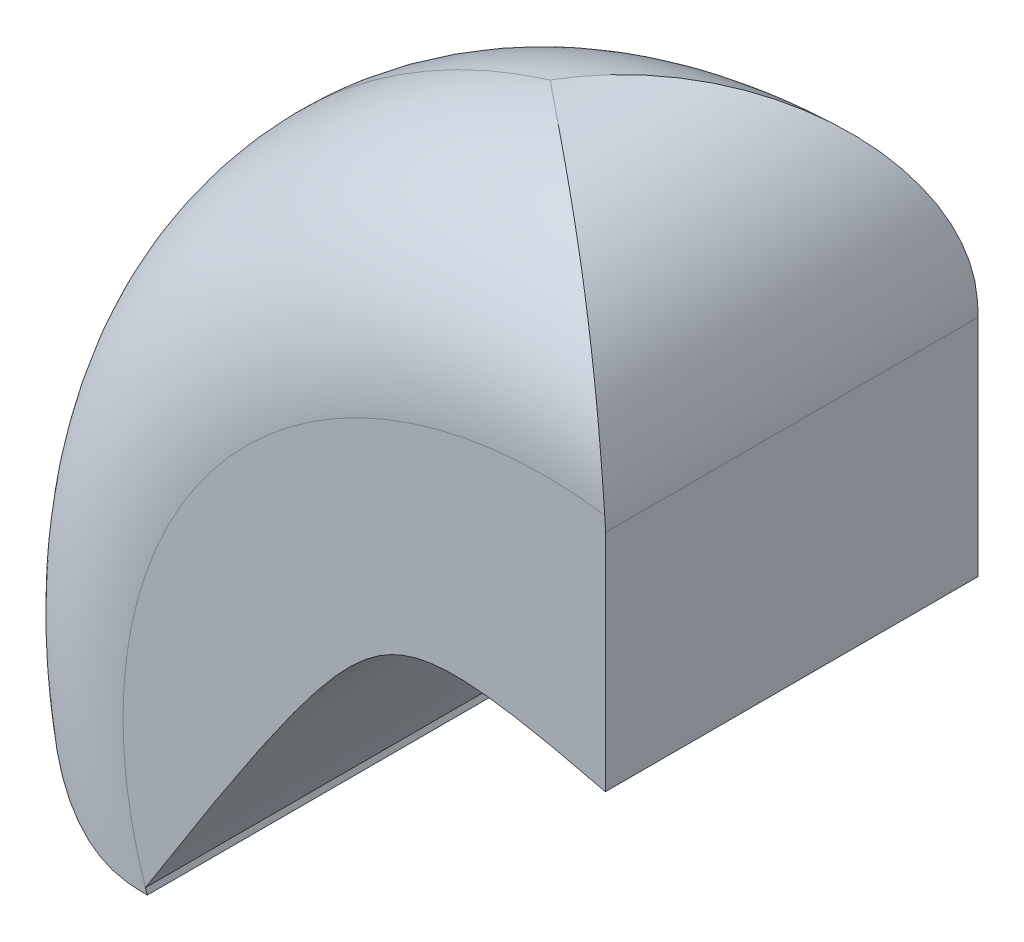
ISO-10303-21;
HEADER;
FILE_DESCRIPTION(('STEP AP214'),'2;1');
FILE_NAME('part.step','',(''),(''),'','','');
FILE_SCHEMA(('AUTOMOTIVE_DESIGN { 1 0 10303 214 1 1 1 1 }'));
ENDSEC;
DATA;
#1=APPLICATION_CONTEXT('core data for automotive mechanical design processes');
#2=APPLICATION_PROTOCOL_DEFINITION('international standard','automotive_design',2000,#1);
#3=PRODUCT_CONTEXT('',#1,'mechanical');
#4=PRODUCT('Part','Part','',(#3));
#5=PRODUCT_RELATED_PRODUCT_CATEGORY('part','',(#4));
#6=PRODUCT_DEFINITION_FORMATION('','',#4);
#7=PRODUCT_DEFINITION_CONTEXT('part definition',#1,'design');
#8=PRODUCT_DEFINITION('design','',#6,#7);
#9=PRODUCT_DEFINITION_SHAPE('','',#8);
#10=(LENGTH_UNIT() NAMED_UNIT(*) SI_UNIT(.MILLI.,.METRE.));
#11=(NAMED_UNIT(*) PLANE_ANGLE_UNIT() SI_UNIT($,.RADIAN.));
#12=(NAMED_UNIT(*) SI_UNIT($,.STERADIAN.) SOLID_ANGLE_UNIT());
#13=UNCERTAINTY_MEASURE_WITH_UNIT(LENGTH_MEASURE(1.E-05),#10,'distance_accuracy_value','');
#14=(GEOMETRIC_REPRESENTATION_CONTEXT(3) GLOBAL_UNCERTAINTY_ASSIGNED_CONTEXT((#13)) GLOBAL_UNIT_ASSIGNED_CONTEXT((#10,
#11,#12)) REPRESENTATION_CONTEXT('',''));
#15=CARTESIAN_POINT('',(0.,0.,0.));
#16=DIRECTION('',(0.,0.,1.));
#17=DIRECTION('',(1.,0.,0.));
#18=AXIS2_PLACEMENT_3D('',#15,#16,#17);
#19=CARTESIAN_POINT('',(0.,0.,5.08));
#20=DIRECTION('',(-1.,0.,0.));
#21=DIRECTION('',(0.,0.,1.));
#22=AXIS2_PLACEMENT_3D('',#19,#20,#21);
#23=PLANE('',#22);
#24=DIRECTION('',(0.,1.,0.));
#25=VECTOR('',#24,1.);
#26=CARTESIAN_POINT('',(0.,0.,5.08));
#27=LINE('',#26,#25);
#28=CARTESIAN_POINT('',(0.,4.34245675491222,5.08));
#29=VERTEX_POINT('',#28);
#30=CARTESIAN_POINT('',(0.,7.40395362170021,5.08));
#31=VERTEX_POINT('',#30);
#32=EDGE_CURVE('E118',#29,#31,#27,.T.);
#33=ORIENTED_EDGE('',*,*,#32,.F.);
#34=DIRECTION('',(0.,0.,-1.));
#35=VECTOR('',#34,1.);
#36=CARTESIAN_POINT('',(0.,4.34245675491222,5.08));
#37=LINE('',#36,#35);
#38=CARTESIAN_POINT('',(0.,4.34245675491222,0.));
#39=VERTEX_POINT('',#38);
#40=EDGE_CURVE('E273',#29,#39,#37,.T.);
#41=ORIENTED_EDGE('',*,*,#40,.T.);
#42=DIRECTION('',(0.,1.,0.));
#43=VECTOR('',#42,1.);
#44=CARTESIAN_POINT('',(0.,0.,0.));
#45=LINE('',#44,#43);
#46=CARTESIAN_POINT('',(0.,7.40395362170021,0.));
#47=VERTEX_POINT('',#46);
#48=EDGE_CURVE('E97',#39,#47,#45,.T.);
#49=ORIENTED_EDGE('',*,*,#48,.T.);
#50=DIRECTION('',(0.,0.,-1.));
#51=VECTOR('',#50,1.);
#52=CARTESIAN_POINT('',(0.,7.40395362170021,5.08));
#53=LINE('',#52,#51);
#54=EDGE_CURVE('E134',#47,#31,#53,.F.);
#55=ORIENTED_EDGE('',*,*,#54,.T.);
#56=EDGE_LOOP('',(#33,#41,#49,#55));
#57=FACE_BOUND('',#56,.T.);
#58=ADVANCED_FACE('F45',(#57),#23,.F.);
#59=CARTESIAN_POINT('',(0.,0.,5.08));
#60=DIRECTION('',(0.,1.,0.));
#61=DIRECTION('',(-1.,0.,0.));
#62=AXIS2_PLACEMENT_3D('',#59,#60,#61);
#63=PLANE('',#62);
#64=CARTESIAN_POINT('',(-6.54316799946702,0.,0.0157109597668454));
#65=CARTESIAN_POINT('',(-6.49355678094474,0.,0.0104676259886185));
#66=CARTESIAN_POINT('',(-6.44387648483013,0.,0.00653671245842265));
#67=CARTESIAN_POINT('',(-6.34437793053601,0.,0.00129973605869758));
#68=CARTESIAN_POINT('',(-6.29455967289278,0.,-6.3370000552407E-06));
#69=CARTESIAN_POINT('',(-6.24467233819353,0.,0.));
#70=B_SPLINE_CURVE_WITH_KNOTS('',3,(#64,#65,#66,#67,#68,#69),.UNSPECIFIED.,.F.,.F.,(4,2,4),(0.,
0.149506705966484,0.299012831570005),.UNSPECIFIED.);
#71=CARTESIAN_POINT('',(-6.54316799946702,0.,0.0157109597668454));
#72=VERTEX_POINT('',#71);
#73=CARTESIAN_POINT('',(-6.24467233819353,0.,0.));
#74=VERTEX_POINT('',#73);
#75=EDGE_CURVE('E123',#72,#74,#70,.T.);
#76=ORIENTED_EDGE('',*,*,#75,.T.);
#77=DIRECTION('',(0.,0.,-1.));
#78=VECTOR('',#77,1.);
#79=CARTESIAN_POINT('',(-6.24467233819353,0.,5.08));
#80=LINE('',#79,#78);
#81=CARTESIAN_POINT('',(-6.24467233819353,0.,5.08));
#82=VERTEX_POINT('',#81);
#83=EDGE_CURVE('E148',#82,#74,#80,.T.);
#84=ORIENTED_EDGE('',*,*,#83,.F.);
#85=CARTESIAN_POINT('',(-6.24467233819353,0.,5.08));
#86=CARTESIAN_POINT('',(-6.29455967289278,0.,5.08000633700006));
#87=CARTESIAN_POINT('',(-6.34437793053601,0.,5.0787002639413));
#88=CARTESIAN_POINT('',(-6.44387648483013,0.,5.07346328754158));
#89=CARTESIAN_POINT('',(-6.49355678094474,0.,5.06953237401138));
#90=CARTESIAN_POINT('',(-6.54316799946702,0.,5.06428904023316));
#91=B_SPLINE_CURVE_WITH_KNOTS('',3,(#85,#86,#87,#88,#89,#90),.UNSPECIFIED.,.F.,.F.,(4,2,4),(0.,
0.14950612560352,0.299012831570005),.UNSPECIFIED.);
#92=CARTESIAN_POINT('',(-6.54316799946702,0.,5.06428904023316));
#93=VERTEX_POINT('',#92);
#94=EDGE_CURVE('E11',#82,#93,#91,.T.);
#95=ORIENTED_EDGE('',*,*,#94,.T.);
#96=DIRECTION('',(0.,0.,-1.));
#97=VECTOR('',#96,1.);
#98=CARTESIAN_POINT('',(-6.54316799946702,0.,5.08));
#99=LINE('',#98,#97);
#100=EDGE_CURVE('E57',#93,#72,#99,.T.);
#101=ORIENTED_EDGE('',*,*,#100,.T.);
#102=EDGE_LOOP('',(#76,#84,#95,#101));
#103=FACE_BOUND('',#102,.T.);
#104=ADVANCED_FACE('F193',(#103),#63,.F.);
#105=CARTESIAN_POINT('',(-0.837038302501056,1.92303351468843,5.08));
#106=DIRECTION('',(0.,0.,-1.));
#107=DIRECTION('',(-1.,0.,0.));
#108=AXIS2_PLACEMENT_3D('',#105,#106,#107);
#109=PLANE('',#108);
#110=CARTESIAN_POINT('',(-0.837038302501056,1.92303351468843,5.08));
#111=DIRECTION('',(0.,0.,-1.));
#112=DIRECTION('',(-1.,0.,0.));
#113=AXIS2_PLACEMENT_3D('',#110,#111,#112);
#114=CIRCLE('',#113,5.73938705460736);
#115=CARTESIAN_POINT('',(-0.00774773136569848,7.60219198326637,5.08));
#116=VERTEX_POINT('',#115);
#117=CARTESIAN_POINT('',(-6.27077992340722,0.0750573893484264,5.08));
#118=VERTEX_POINT('',#117);
#119=EDGE_CURVE('E116',#116,#118,#114,.F.);
#120=ORIENTED_EDGE('',*,*,#119,.T.);
#121=CARTESIAN_POINT('',(-6.27077992340722,0.0750573893484264,5.08));
#122=CARTESIAN_POINT('',(-3.10583538181274,5.11338393814638,5.08));
#123=CARTESIAN_POINT('',(0.,4.34245675491222,5.08));
#124=(BOUNDED_CURVE() B_SPLINE_CURVE(2,(#121,#122,#123),.UNSPECIFIED.,.F.,
.F.) B_SPLINE_CURVE_WITH_KNOTS((3,3),(0.,1.),
.UNSPECIFIED.) CURVE() GEOMETRIC_REPRESENTATION_ITEM() RATIONAL_B_SPLINE_CURVE((1.,3.,1.)) REPRESENTATION_ITEM(''));
#125=EDGE_CURVE('E232',#118,#29,#124,.T.);
#126=ORIENTED_EDGE('',*,*,#125,.T.);
#127=ORIENTED_EDGE('',*,*,#32,.T.);
#128=CARTESIAN_POINT('',(-2.54,7.40395362170021,5.08));
#129=DIRECTION('',(0.,0.,-1.));
#130=DIRECTION('',(-1.,0.,0.));
#131=AXIS2_PLACEMENT_3D('',#128,#129,#130);
#132=CIRCLE('',#131,2.54);
#133=EDGE_CURVE('E111',#31,#116,#132,.F.);
#134=ORIENTED_EDGE('',*,*,#133,.T.);
#135=EDGE_LOOP('',(#120,#126,#127,#134));
#136=FACE_BOUND('',#135,.T.);
#137=ADVANCED_FACE('F113',(#136),#109,.F.);
#138=CARTESIAN_POINT('',(-0.837038302501056,1.92303351468843,0.));
#139=DIRECTION('',(0.,0.,-1.));
#140=DIRECTION('',(-1.,0.,0.));
#141=AXIS2_PLACEMENT_3D('',#138,#139,#140);
#142=PLANE('',#141);
#143=CARTESIAN_POINT('',(-6.27077992340722,0.0750573893484264,0.));
#144=CARTESIAN_POINT('',(-3.10583538181274,5.11338393814638,0.));
#145=CARTESIAN_POINT('',(0.,4.34245675491222,0.));
#146=(BOUNDED_CURVE() B_SPLINE_CURVE(2,(#143,#144,#145),.UNSPECIFIED.,.F.,
.F.) B_SPLINE_CURVE_WITH_KNOTS((3,3),(0.,1.),
.UNSPECIFIED.) CURVE() GEOMETRIC_REPRESENTATION_ITEM() RATIONAL_B_SPLINE_CURVE((1.,3.,1.)) REPRESENTATION_ITEM(''));
#147=CARTESIAN_POINT('',(-6.27077992340721,0.0750573893483978,0.));
#148=VERTEX_POINT('',#147);
#149=EDGE_CURVE('E217',#148,#39,#146,.T.);
#150=ORIENTED_EDGE('',*,*,#149,.F.);
#151=CARTESIAN_POINT('',(-0.837038302501056,1.92303351468843,0.));
#152=DIRECTION('',(0.,0.,-1.));
#153=DIRECTION('',(-1.,0.,0.));
#154=AXIS2_PLACEMENT_3D('',#151,#152,#153);
#155=CIRCLE('',#154,5.73938705460736);
#156=CARTESIAN_POINT('',(-0.00774773136569848,7.60219198326637,0.));
#157=VERTEX_POINT('',#156);
#158=EDGE_CURVE('E190',#148,#157,#155,.T.);
#159=ORIENTED_EDGE('',*,*,#158,.T.);
#160=CARTESIAN_POINT('',(-2.54,7.40395362170021,0.));
#161=DIRECTION('',(0.,0.,-1.));
#162=DIRECTION('',(-1.,0.,0.));
#163=AXIS2_PLACEMENT_3D('',#160,#161,#162);
#164=CIRCLE('',#163,2.54);
#165=EDGE_CURVE('E285',#157,#47,#164,.T.);
#166=ORIENTED_EDGE('',*,*,#165,.T.);
#167=ORIENTED_EDGE('',*,*,#48,.F.);
#168=EDGE_LOOP('',(#150,#159,#166,#167));
#169=FACE_BOUND('',#168,.T.);
#170=ADVANCED_FACE('F197',(#169),#142,.T.);
#171=CARTESIAN_POINT('',(-6.54316799946702,2.54,5.08));
#172=DIRECTION('',(0.,0.,-1.));
#173=DIRECTION('',(-1.,0.,0.));
#174=AXIS2_PLACEMENT_3D('',#171,#172,#173);
#175=CYLINDRICAL_SURFACE('',#174,2.54);
#176=CARTESIAN_POINT('',(-6.54316799946702,0.,0.0157109597668451));
#177=CARTESIAN_POINT('',(-6.60714881719256,-1.28476726861553E-05,0.0224810006136962));
#178=CARTESIAN_POINT('',(-6.67087189456624,0.00241678674781688,0.0313703791266913));
#179=CARTESIAN_POINT('',(-6.79722853600247,0.0119484091850614,0.0530128650855246));
#180=CARTESIAN_POINT('',(-6.85986333890803,0.0190446708566967,0.0657612268995341));
#181=CARTESIAN_POINT('',(-6.98311907072323,0.0376211379207654,0.0946456974701581));
#182=CARTESIAN_POINT('',(-7.04375233441022,0.0490647689231595,0.110753050488879));
#183=CARTESIAN_POINT('',(-7.16317123313368,0.0760706008914642,0.146062834106937));
#184=CARTESIAN_POINT('',(-7.22195631280763,0.0916340268319717,0.165266184601192));
#185=CARTESIAN_POINT('',(-7.3944743533249,0.143911035221132,0.226806496038314));
#186=CARTESIAN_POINT('',(-7.50508249855254,0.186324022130721,0.273246818079727));
#187=CARTESIAN_POINT('',(-7.71630395075185,0.284125037142435,0.374788713681231));
#188=CARTESIAN_POINT('',(-7.81689006522029,0.339547066220788,0.429912857305286));
#189=CARTESIAN_POINT('',(-8.04489271387911,0.48542094705091,0.570220342762428));
#190=CARTESIAN_POINT('',(-8.167045549783,0.581034066375106,0.658633033240366));
#191=CARTESIAN_POINT('',(-8.38855616536181,0.788090637724865,0.844707168168847));
#192=CARTESIAN_POINT('',(-8.48789800077185,0.899545074833337,0.942375014764863));
#193=CARTESIAN_POINT('',(-8.66463604113625,1.13538738908608,1.14546028528494));
#194=CARTESIAN_POINT('',(-8.74175070147136,1.25991605512064,1.25095750158529));
#195=CARTESIAN_POINT('',(-8.87253627349082,1.51702945528297,1.46659720303595));
#196=CARTESIAN_POINT('',(-8.92619162888262,1.64961946887078,1.57674271764425));
#197=CARTESIAN_POINT('',(-9.02010785224863,1.95110727130301,1.82618189686954));
#198=CARTESIAN_POINT('',(-9.05430150127103,2.12124435133146,1.9662680335754));
#199=CARTESIAN_POINT('',(-9.08777442808837,2.46287865372027,2.24839475454085));
#200=CARTESIAN_POINT('',(-9.0871229268869,2.63437250285147,2.39043090359038));
#201=CARTESIAN_POINT('',(-9.06911085933865,2.80687512769028,2.5348359109606));
#202=CARTESIAN_POINT('',(-9.06878313138247,2.80995901712403,2.53741799483571));
#203=CARTESIAN_POINT('',(-9.06844975732627,2.81304220081017,2.54));
#204=B_SPLINE_CURVE_WITH_KNOTS('',3,(#176,#177,#178,#179,#180,#181,#182,#183,#184,#185,#186,
#187,#188,#189,#190,#191,#192,#193,#194,#195,#196,#197,#198,#199,#200,#201,#202,#203),
.UNSPECIFIED.,.F.,.F.,(4,2,2,2,2,2,2,2,2,2,2,2,2,4),(0.,0.192883410046523,0.385530576424733,
0.576591662394493,0.767709622162052,1.14774768198885,1.52879030806886,2.06155202858977,
2.59468500904678,3.1343008102322,3.67427389977829,4.34052994901157,5.00546250858169,
5.01756886958733),.UNSPECIFIED.);
#205=CARTESIAN_POINT('',(-9.06844975732627,2.81304220081017,2.54));
#206=VERTEX_POINT('',#205);
#207=EDGE_CURVE('E141',#72,#206,#204,.T.);
#208=ORIENTED_EDGE('',*,*,#207,.F.);
#209=ORIENTED_EDGE('',*,*,#100,.F.);
#210=CARTESIAN_POINT('',(-6.54316799946702,0.,5.06428904023316));
#211=CARTESIAN_POINT('',(-6.60714881719256,-1.28476726862409E-05,5.0575189993863));
#212=CARTESIAN_POINT('',(-6.67087189456624,0.00241678674781677,5.04862962087331));
#213=CARTESIAN_POINT('',(-6.79722853600247,0.0119484091850613,5.02698713491448));
#214=CARTESIAN_POINT('',(-6.85986333890803,0.0190446708566966,5.01423877310047));
#215=CARTESIAN_POINT('',(-6.98311907072323,0.0376211379207652,4.98535430252984));
#216=CARTESIAN_POINT('',(-7.04375233441022,0.0490647689231592,4.96924694951112));
#217=CARTESIAN_POINT('',(-7.16317123313368,0.076070600891464,4.93393716589306));
#218=CARTESIAN_POINT('',(-7.22195631280763,0.0916340268319716,4.91473381539881));
#219=CARTESIAN_POINT('',(-7.3944743533249,0.143911035221132,4.85319350396169));
#220=CARTESIAN_POINT('',(-7.50508249855254,0.186324022130721,4.80675318192027));
#221=CARTESIAN_POINT('',(-7.71630395075185,0.284125037142436,4.70521128631877));
#222=CARTESIAN_POINT('',(-7.81689006522029,0.339547066220789,4.65008714269471));
#223=CARTESIAN_POINT('',(-8.04489271387911,0.48542094705091,4.50977965723757));
#224=CARTESIAN_POINT('',(-8.167045549783,0.581034066375106,4.42136696675963));
#225=CARTESIAN_POINT('',(-8.38855616536181,0.788090637724865,4.23529283183115));
#226=CARTESIAN_POINT('',(-8.48789800077185,0.899545074833337,4.13762498523514));
#227=CARTESIAN_POINT('',(-8.66463604113625,1.13538738908608,3.93453971471506));
#228=CARTESIAN_POINT('',(-8.74175070147136,1.25991605512064,3.82904249841471));
#229=CARTESIAN_POINT('',(-8.87253627349082,1.51702945528297,3.61340279696405));
#230=CARTESIAN_POINT('',(-8.92619162888262,1.64961946887078,3.50325728235575));
#231=CARTESIAN_POINT('',(-9.02010785224863,1.95110727130301,3.25381810313046));
#232=CARTESIAN_POINT('',(-9.05430150127103,2.12124435133145,3.11373196642459));
#233=CARTESIAN_POINT('',(-9.08777442808837,2.46287865372027,2.83160524545916));
#234=CARTESIAN_POINT('',(-9.0871229268869,2.63437250285148,2.68956909640963));
#235=CARTESIAN_POINT('',(-9.06911085933865,2.80687512769028,2.5451640890394));
#236=CARTESIAN_POINT('',(-9.06878313138247,2.80995901712403,2.54258200516429));
#237=CARTESIAN_POINT('',(-9.06844975732627,2.81304220081017,2.54));
#238=B_SPLINE_CURVE_WITH_KNOTS('',3,(#210,#211,#212,#213,#214,#215,#216,#217,#218,#219,#220,
#221,#222,#223,#224,#225,#226,#227,#228,#229,#230,#231,#232,#233,#234,#235,#236,#237),
.UNSPECIFIED.,.F.,.F.,(4,2,2,2,2,2,2,2,2,2,2,2,2,4),(0.,0.192883410046523,0.385530576424732,
0.576591662394493,0.767709622162052,1.14774768198885,1.52879030806886,2.06155202858977,
2.59468500904678,3.1343008102322,3.67427389977829,4.34052994901157,5.00546250858169,
5.01756886958733),.UNSPECIFIED.);
#239=EDGE_CURVE('E88',#206,#93,#238,.F.);
#240=ORIENTED_EDGE('',*,*,#239,.F.);
#241=EDGE_LOOP('',(#208,#209,#240));
#242=FACE_BOUND('',#241,.T.);
#243=ADVANCED_FACE('F47',(#242),#175,.T.);
#244=CARTESIAN_POINT('',(-0.837038302501056,1.92303351468843,2.54));
#245=DIRECTION('',(0.,0.,-1.));
#246=DIRECTION('',(-1.,0.,0.));
#247=AXIS2_PLACEMENT_3D('',#244,#245,#246);
#248=TOROIDAL_SURFACE('',#247,5.73938705460736,2.54);
#249=CARTESIAN_POINT('',(-0.837038302501056,1.92303351468843,2.54));
#250=DIRECTION('',(0.,0.,-1.));
#251=DIRECTION('',(-1.,0.,0.));
#252=AXIS2_PLACEMENT_3D('',#249,#250,#251);
#253=CIRCLE('',#252,8.27938705460736);
#254=CARTESIAN_POINT('',(-3.29365586437927,9.82956753122636,2.54));
#255=VERTEX_POINT('',#254);
#256=EDGE_CURVE('E146',#206,#255,#253,.T.);
#257=ORIENTED_EDGE('',*,*,#256,.F.);
#258=ORIENTED_EDGE('',*,*,#239,.T.);
#259=ORIENTED_EDGE('',*,*,#94,.F.);
#260=CARTESIAN_POINT('',(-6.24467233819353,0.,5.08));
#261=CARTESIAN_POINT('',(-6.24578178818526,0.00311981017111341,5.08));
#262=CARTESIAN_POINT('',(-6.24688853831713,0.00624058045175843,5.08));
#263=CARTESIAN_POINT('',(-6.2490966355585,0.0124840318790026,5.08));
#264=CARTESIAN_POINT('',(-6.25019798266801,0.0156067130256019,5.08));
#265=CARTESIAN_POINT('',(-6.25239527056204,0.0218539768316577,5.08));
#266=CARTESIAN_POINT('',(-6.25349121134656,0.0249785594911144,5.08));
#267=CARTESIAN_POINT('',(-6.25567768330856,0.0312296169625446,5.08));
#268=CARTESIAN_POINT('',(-6.25676821448603,0.0343560917745181,5.08));
#269=CARTESIAN_POINT('',(-6.25894386396681,0.0406109241854185,5.08));
#270=CARTESIAN_POINT('',(-6.26002898227012,0.0437392817843453,5.08));
#271=CARTESIAN_POINT('',(-6.26219380275232,0.0499978703977305,5.08));
#272=CARTESIAN_POINT('',(-6.2632735049312,0.0531281014121889,5.08));
#273=CARTESIAN_POINT('',(-6.26542748992924,0.0593904274800281,5.08));
#274=CARTESIAN_POINT('',(-6.26650177274839,0.0625225225334088,5.08));
#275=CARTESIAN_POINT('',(-6.26864491581229,0.0687885672954092,5.08));
#276=CARTESIAN_POINT('',(-6.26971377605703,0.0719225170040288,5.08));
#277=CARTESIAN_POINT('',(-6.27077992340722,0.0750573893484238,5.08));
#278=B_SPLINE_CURVE_WITH_KNOTS('',3,(#260,#261,#262,#263,#264,#265,#266,#267,#268,#269,#270,
#271,#272,#273,#274,#275,#276,#277),.UNSPECIFIED.,.F.,.F.,(4,2,2,2,2,2,2,2,4),(0.,
0.00993362111509972,0.0198672422301952,0.0298008633452953,0.03973448446039,0.0496681055754851,
0.0596017266905851,0.0695353478056805,0.0794689689207806),.UNSPECIFIED.);
#279=EDGE_CURVE('E132',#82,#118,#278,.T.);
#280=ORIENTED_EDGE('',*,*,#279,.T.);
#281=ORIENTED_EDGE('',*,*,#119,.F.);
#282=CARTESIAN_POINT('',(-0.00774773136569843,7.60219198326637,5.08));
#283=CARTESIAN_POINT('',(-0.0124037908059106,7.66184961928538,5.0800087513756));
#284=CARTESIAN_POINT('',(-0.0191941264921294,7.72131855625276,5.07798916843495));
#285=CARTESIAN_POINT('',(-0.0368850521955316,7.83933009237561,5.07014452638805));
#286=CARTESIAN_POINT('',(-0.0477815425398501,7.89787355499768,5.06432325872977));
#287=CARTESIAN_POINT('',(-0.0734348645494268,8.01314992193633,5.04918535600712));
#288=CARTESIAN_POINT('',(-0.0881605960884955,8.06989345911759,5.03989662948735));
#289=CARTESIAN_POINT('',(-0.121286187115521,8.1816589499645,5.01810412274041));
#290=CARTESIAN_POINT('',(-0.139686865017199,8.2366805169831,5.00559962617973));
#291=CARTESIAN_POINT('',(-0.199880803386818,8.39822817730459,4.96379909565233));
#292=CARTESIAN_POINT('',(-0.246791138368046,8.50178594712665,4.9301394213574));
#293=CARTESIAN_POINT('',(-0.352161087697061,8.69915516813249,4.85333420462024));
#294=CARTESIAN_POINT('',(-0.410647100993167,8.79294357940293,4.81016695377863));
#295=CARTESIAN_POINT('',(-0.559675993997041,9.00134041571995,4.69946133481418));
#296=CARTESIAN_POINT('',(-0.654206588847845,9.11141598293963,4.62872583114615));
#297=CARTESIAN_POINT('',(-0.856029241982378,9.31079395126365,4.47706624064237));
#298=CARTESIAN_POINT('',(-0.963337196342943,9.40007005937911,4.39612945510177));
#299=CARTESIAN_POINT('',(-1.21372013995268,9.57681663349793,4.20648426916653));
#300=CARTESIAN_POINT('',(-1.35920235916713,9.65872303076807,4.09576976916503));
#301=CARTESIAN_POINT('',(-1.65796396977771,9.7915023105089,3.86663358910395));
#302=CARTESIAN_POINT('',(-1.81124998411714,9.84234834041101,3.7482053378796));
#303=CARTESIAN_POINT('',(-2.1224395402398,9.91453607999357,3.50498229953734));
#304=CARTESIAN_POINT('',(-2.28037539329774,9.93554545382114,3.38013160976972));
#305=CARTESIAN_POINT('',(-2.59469014735819,9.94822643384095,3.12755078635295));
#306=CARTESIAN_POINT('',(-2.75107080313186,9.93993608348508,2.99982460039872));
#307=CARTESIAN_POINT('',(-3.03371591313535,9.89890677720055,2.76382029732412));
#308=CARTESIAN_POINT('',(-3.16075600304004,9.8703449249352,2.65574271579921));
#309=CARTESIAN_POINT('',(-3.28773106676035,9.83140246613624,2.545164113523));
#310=CARTESIAN_POINT('',(-3.29069433984387,9.83048770322522,2.54258202979049));
#311=CARTESIAN_POINT('',(-3.29365586437927,9.82956753122636,2.54));
#312=B_SPLINE_CURVE_WITH_KNOTS('',3,(#282,#283,#284,#285,#286,#287,#288,#289,#290,#291,#292,
#293,#294,#295,#296,#297,#298,#299,#300,#301,#302,#303,#304,#305,#306,#307,#308,#309,#310,#311),
.UNSPECIFIED.,.F.,.F.,(4,2,2,2,2,2,2,2,2,2,2,2,2,2,4),(0.,0.179412283289363,0.358645910081305,
0.536466996950795,0.714327728976481,1.06836704503605,1.42322326817,1.90485818718616,
2.38709868590467,2.98495169354219,3.58332083327128,4.18830399721821,4.79250192553294,
5.29884522706015,5.31095158806578),.UNSPECIFIED.);
#313=EDGE_CURVE('E129',#255,#116,#312,.F.);
#314=ORIENTED_EDGE('',*,*,#313,.F.);
#315=EDGE_LOOP('',(#257,#258,#259,#280,#281,#314));
#316=FACE_BOUND('',#315,.T.);
#317=ADVANCED_FACE('F128',(#316),#248,.T.);
#318=CARTESIAN_POINT('',(-0.837038302501056,1.92303351468843,2.54));
#319=DIRECTION('',(0.,0.,-1.));
#320=DIRECTION('',(-1.,0.,0.));
#321=AXIS2_PLACEMENT_3D('',#318,#319,#320);
#322=TOROIDAL_SURFACE('',#321,5.73938705460736,2.54);
#323=ORIENTED_EDGE('',*,*,#207,.T.);
#324=ORIENTED_EDGE('',*,*,#256,.T.);
#325=CARTESIAN_POINT('',(-0.00774773136569843,7.60219198326637,0.));
#326=CARTESIAN_POINT('',(-0.0124037908059108,7.66184961928538,-8.75137560149685E-06));
#327=CARTESIAN_POINT('',(-0.0191941264921296,7.72131855625276,0.00201083156505524));
#328=CARTESIAN_POINT('',(-0.0368850521955316,7.83933009237561,0.00985547361194899));
#329=CARTESIAN_POINT('',(-0.0477815425398499,7.89787355499768,0.0156767412702318));
#330=CARTESIAN_POINT('',(-0.0734348645494265,8.01314992193633,0.0308146439928752));
#331=CARTESIAN_POINT('',(-0.0881605960884953,8.06989345911759,0.040103370512647));
#332=CARTESIAN_POINT('',(-0.121286187115521,8.1816589499645,0.0618958772595885));
#333=CARTESIAN_POINT('',(-0.1396868650172,8.2366805169831,0.0744003738202751));
#334=CARTESIAN_POINT('',(-0.199880803386819,8.39822817730459,0.116200904347671));
#335=CARTESIAN_POINT('',(-0.246791138368046,8.50178594712665,0.149860578642603));
#336=CARTESIAN_POINT('',(-0.352161087697062,8.69915516813249,0.226665795379762));
#337=CARTESIAN_POINT('',(-0.410647100993168,8.79294357940293,0.269833046221375));
#338=CARTESIAN_POINT('',(-0.55967599399704,9.00134041571994,0.380538665185815));
#339=CARTESIAN_POINT('',(-0.654206588847842,9.11141598293963,0.451274168853848));
#340=CARTESIAN_POINT('',(-0.856029241982375,9.31079395126364,0.602933759357623));
#341=CARTESIAN_POINT('',(-0.963337196342944,9.4000700593791,0.683870544898229));
#342=CARTESIAN_POINT('',(-1.21372013995268,9.57681663349794,0.873515730833479));
#343=CARTESIAN_POINT('',(-1.35920235916713,9.65872303076807,0.984230230834991));
#344=CARTESIAN_POINT('',(-1.65796396977773,9.79150231050889,1.21336641089604));
#345=CARTESIAN_POINT('',(-1.81124998411719,9.84234834041099,1.33179466212033));
#346=CARTESIAN_POINT('',(-2.12243954023973,9.91453607999359,1.57501770046273));
#347=CARTESIAN_POINT('',(-2.28037539329752,9.9355454538212,1.69986839023053));
#348=CARTESIAN_POINT('',(-2.59469014735838,9.94822643384088,1.95244921364679));
#349=CARTESIAN_POINT('',(-2.75107080313262,9.93993608348484,2.08017539960032));
#350=CARTESIAN_POINT('',(-3.0337159131347,9.89890677720074,2.31617970267669));
#351=CARTESIAN_POINT('',(-3.16075600303783,9.87034492493587,2.42425728420357));
#352=CARTESIAN_POINT('',(-3.28773106676025,9.83140246613628,2.53483588647713));
#353=CARTESIAN_POINT('',(-3.29069433984382,9.83048770322523,2.53741797020958));
#354=CARTESIAN_POINT('',(-3.29365586437927,9.82956753122636,2.54));
#355=B_SPLINE_CURVE_WITH_KNOTS('',3,(#325,#326,#327,#328,#329,#330,#331,#332,#333,#334,#335,
#336,#337,#338,#339,#340,#341,#342,#343,#344,#345,#346,#347,#348,#349,#350,#351,#352,#353,#354),
.UNSPECIFIED.,.F.,.F.,(4,2,2,2,2,2,2,2,2,2,2,2,2,2,4),(0.,0.179412283289362,0.358645910081303,
0.536466996950795,0.714327728976481,1.06836704503605,1.42322326817,1.90485818718615,
2.38709868590467,2.9849516935422,3.58332083327128,4.18830399721819,4.79250192553294,
5.29884522706015,5.31095158806578),.UNSPECIFIED.);
#356=EDGE_CURVE('E139',#157,#255,#355,.T.);
#357=ORIENTED_EDGE('',*,*,#356,.F.);
#358=ORIENTED_EDGE('',*,*,#158,.F.);
#359=CARTESIAN_POINT('',(-6.24467233819353,0.,0.));
#360=DIRECTION('',(-0.32852811437326,0.944494191653051,0.));
#361=VECTOR('',#360,1.);
#362=LINE('',#359,#361);
#363=EDGE_CURVE('E65',#74,#148,#362,.T.);
#364=ORIENTED_EDGE('',*,*,#363,.F.);
#365=ORIENTED_EDGE('',*,*,#75,.F.);
#366=EDGE_LOOP('',(#323,#324,#357,#358,#364,#365));
#367=FACE_BOUND('',#366,.T.);
#368=ADVANCED_FACE('F171',(#367),#322,.T.);
#369=CARTESIAN_POINT('',(-2.54,7.40395362170021,5.08));
#370=DIRECTION('',(0.,0.,-1.));
#371=DIRECTION('',(-1.,0.,0.));
#372=AXIS2_PLACEMENT_3D('',#369,#370,#371);
#373=CYLINDRICAL_SURFACE('',#372,2.54);
#374=ORIENTED_EDGE('',*,*,#133,.F.);
#375=ORIENTED_EDGE('',*,*,#54,.F.);
#376=ORIENTED_EDGE('',*,*,#165,.F.);
#377=ORIENTED_EDGE('',*,*,#356,.T.);
#378=ORIENTED_EDGE('',*,*,#313,.T.);
#379=EDGE_LOOP('',(#374,#375,#376,#377,#378));
#380=FACE_BOUND('',#379,.T.);
#381=ADVANCED_FACE('F136',(#380),#373,.T.);
#382=CARTESIAN_POINT('',(-6.24467233819353,0.,5.08));
#383=DIRECTION('',(-0.944494191653051,-0.32852811437326,0.));
#384=DIRECTION('',(0.32852811437326,-0.944494191653051,0.));
#385=AXIS2_PLACEMENT_3D('',#382,#383,#384);
#386=PLANE('',#385);
#387=ORIENTED_EDGE('',*,*,#363,.T.);
#388=DIRECTION('',(0.,0.,-1.));
#389=VECTOR('',#388,1.);
#390=CARTESIAN_POINT('',(-6.27077992340722,0.0750573893484264,5.08));
#391=LINE('',#390,#389);
#392=EDGE_CURVE('E275',#118,#148,#391,.T.);
#393=ORIENTED_EDGE('',*,*,#392,.F.);
#394=ORIENTED_EDGE('',*,*,#279,.F.);
#395=ORIENTED_EDGE('',*,*,#83,.T.);
#396=EDGE_LOOP('',(#387,#393,#394,#395));
#397=FACE_BOUND('',#396,.T.);
#398=ADVANCED_FACE('F170',(#397),#386,.F.);
#399=DIRECTION('',(0.,0.,-1.));
#400=VECTOR('',#399,1.);
#401=SURFACE_OF_LINEAR_EXTRUSION('',#124,#400);
#402=ORIENTED_EDGE('',*,*,#149,.T.);
#403=ORIENTED_EDGE('',*,*,#40,.F.);
#404=ORIENTED_EDGE('',*,*,#125,.F.);
#405=ORIENTED_EDGE('',*,*,#392,.T.);
#406=EDGE_LOOP('',(#402,#403,#404,#405));
#407=FACE_BOUND('',#406,.T.);
#408=ADVANCED_FACE('F259',(#407),#401,.F.);
#409=CLOSED_SHELL('',(#58,#104,#137,#170,#243,#317,#368,#381,#398,#408));
#410=MANIFOLD_SOLID_BREP('B2',#409);
#411=ADVANCED_BREP_SHAPE_REPRESENTATION('',(#18,#410),#14);
#412=SHAPE_DEFINITION_REPRESENTATION(#9,#411);
ENDSEC;
END-ISO-10303-21;
